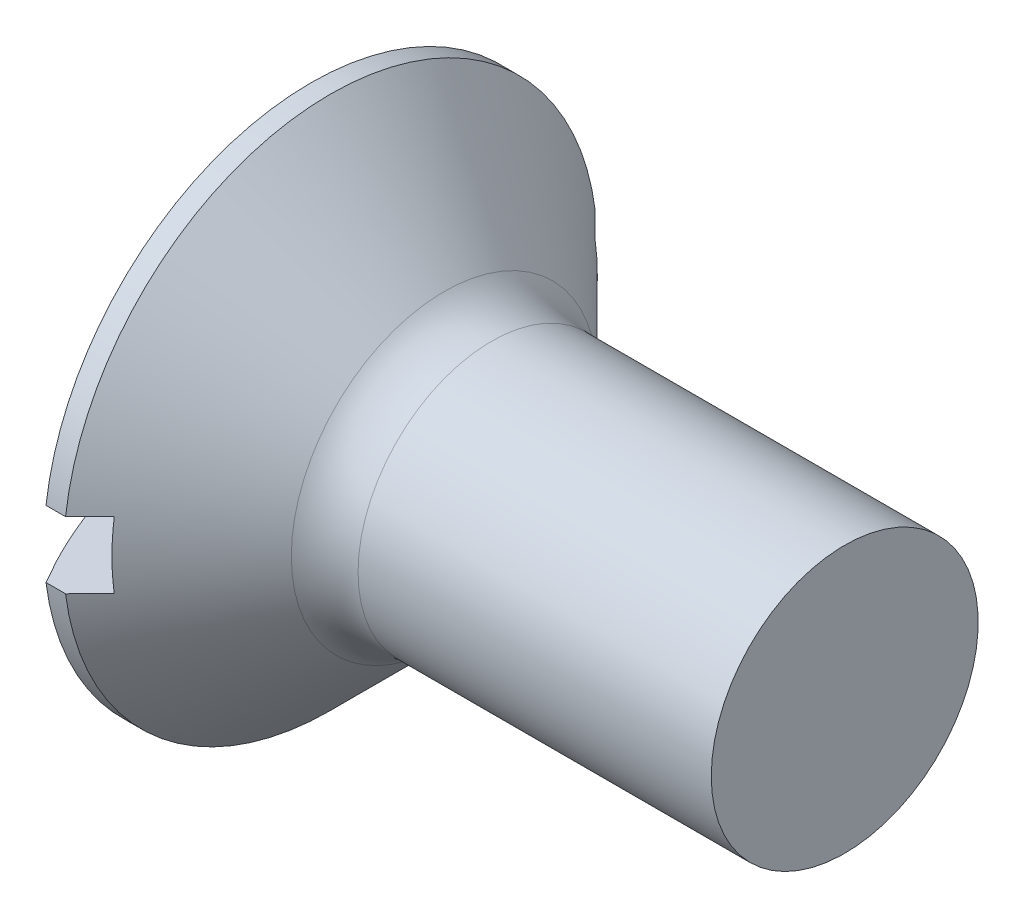
ISO-10303-21;
HEADER;
FILE_DESCRIPTION(('STEP AP214'),'2;1');
FILE_NAME('part.step','',(''),(''),'','','');
FILE_SCHEMA(('AUTOMOTIVE_DESIGN { 1 0 10303 214 1 1 1 1 }'));
ENDSEC;
DATA;
#1=APPLICATION_CONTEXT('core data for automotive mechanical design processes');
#2=APPLICATION_PROTOCOL_DEFINITION('international standard','automotive_design',2000,#1);
#3=PRODUCT_CONTEXT('',#1,'mechanical');
#4=PRODUCT('Part','Part','',(#3));
#5=PRODUCT_RELATED_PRODUCT_CATEGORY('part','',(#4));
#6=PRODUCT_DEFINITION_FORMATION('','',#4);
#7=PRODUCT_DEFINITION_CONTEXT('part definition',#1,'design');
#8=PRODUCT_DEFINITION('design','',#6,#7);
#9=PRODUCT_DEFINITION_SHAPE('','',#8);
#10=(LENGTH_UNIT() NAMED_UNIT(*) SI_UNIT(.MILLI.,.METRE.));
#11=(NAMED_UNIT(*) PLANE_ANGLE_UNIT() SI_UNIT($,.RADIAN.));
#12=(NAMED_UNIT(*) SI_UNIT($,.STERADIAN.) SOLID_ANGLE_UNIT());
#13=UNCERTAINTY_MEASURE_WITH_UNIT(LENGTH_MEASURE(1.E-05),#10,'distance_accuracy_value','');
#14=(GEOMETRIC_REPRESENTATION_CONTEXT(3) GLOBAL_UNCERTAINTY_ASSIGNED_CONTEXT((#13)) GLOBAL_UNIT_ASSIGNED_CONTEXT((#10,
#11,#12)) REPRESENTATION_CONTEXT('',''));
#15=CARTESIAN_POINT('',(0.,0.,0.));
#16=DIRECTION('',(0.,0.,1.));
#17=DIRECTION('',(1.,0.,0.));
#18=AXIS2_PLACEMENT_3D('',#15,#16,#17);
#19=CARTESIAN_POINT('',(-1.34990698556869,0.,0.));
#20=DIRECTION('',(-1.,0.,0.));
#21=DIRECTION('',(0.,0.,1.));
#22=AXIS2_PLACEMENT_3D('',#19,#20,#21);
#23=CYLINDRICAL_SURFACE('',#22,10.);
#24=CARTESIAN_POINT('',(3.49156400425037,0.,0.));
#25=DIRECTION('',(-1.,0.,0.));
#26=DIRECTION('',(0.,0.,1.));
#27=AXIS2_PLACEMENT_3D('',#24,#25,#26);
#28=CIRCLE('',#27,10.);
#29=CARTESIAN_POINT('',(3.49156400425037,-1.25,-9.92156741649221));
#30=VERTEX_POINT('',#29);
#31=CARTESIAN_POINT('',(3.49156400425037,-1.25,9.92156741649221));
#32=VERTEX_POINT('',#31);
#33=EDGE_CURVE('E107',#30,#32,#28,.T.);
#34=ORIENTED_EDGE('',*,*,#33,.T.);
#35=DIRECTION('',(-1.,0.,0.));
#36=VECTOR('',#35,1.);
#37=CARTESIAN_POINT('',(-1.34990698556869,-1.25,9.92156741649221));
#38=LINE('',#37,#36);
#39=CARTESIAN_POINT('',(2.7593309572168,-1.25,9.92156741649221));
#40=VERTEX_POINT('',#39);
#41=EDGE_CURVE('E112',#32,#40,#38,.T.);
#42=ORIENTED_EDGE('',*,*,#41,.T.);
#43=CARTESIAN_POINT('',(2.7593309572168,0.,0.));
#44=DIRECTION('',(-1.,0.,0.));
#45=DIRECTION('',(0.,0.,1.));
#46=AXIS2_PLACEMENT_3D('',#43,#44,#45);
#47=CIRCLE('',#46,10.);
#48=CARTESIAN_POINT('',(2.7593309572168,-1.25,-9.92156741649221));
#49=VERTEX_POINT('',#48);
#50=EDGE_CURVE('E157',#49,#40,#47,.T.);
#51=ORIENTED_EDGE('',*,*,#50,.F.);
#52=DIRECTION('',(-1.,0.,0.));
#53=VECTOR('',#52,1.);
#54=CARTESIAN_POINT('',(-1.34990698556869,-1.25,-9.92156741649221));
#55=LINE('',#54,#53);
#56=EDGE_CURVE('E52',#49,#30,#55,.F.);
#57=ORIENTED_EDGE('',*,*,#56,.T.);
#58=EDGE_LOOP('',(#34,#42,#51,#57));
#59=FACE_BOUND('',#58,.T.);
#60=ADVANCED_FACE('F37',(#59),#23,.T.);
#61=CARTESIAN_POINT('',(19.5,0.,0.));
#62=DIRECTION('',(-1.,0.,0.));
#63=DIRECTION('',(0.,1.,0.));
#64=AXIS2_PLACEMENT_3D('',#61,#62,#63);
#65=SPHERICAL_SURFACE('',#64,19.5);
#66=CARTESIAN_POINT('',(2.7593309572168,1.25,9.92156741649221));
#67=VERTEX_POINT('',#66);
#68=CARTESIAN_POINT('',(2.7593309572168,1.25,-9.92156741649221));
#69=VERTEX_POINT('',#68);
#70=EDGE_CURVE('E153',#67,#69,#47,.T.);
#71=ORIENTED_EDGE('',*,*,#70,.T.);
#72=CARTESIAN_POINT('',(19.5,1.25,0.));
#73=DIRECTION('',(0.,1.,0.));
#74=DIRECTION('',(0.,0.,1.));
#75=AXIS2_PLACEMENT_3D('',#72,#73,#74);
#76=CIRCLE('',#75,19.4598946554189);
#77=EDGE_CURVE('E170',#69,#67,#76,.T.);
#78=ORIENTED_EDGE('',*,*,#77,.T.);
#79=EDGE_LOOP('',(#71,#78));
#80=FACE_BOUND('',#79,.T.);
#81=ADVANCED_FACE('F135',(#80),#65,.T.);
#82=CARTESIAN_POINT('',(22.7593309572168,5.,0.));
#83=DIRECTION('',(-1.,0.,0.));
#84=DIRECTION('',(0.,0.,1.));
#85=AXIS2_PLACEMENT_3D('',#82,#83,#84);
#86=PLANE('',#85);
#87=CARTESIAN_POINT('',(22.7593309572168,0.,0.));
#88=DIRECTION('',(-1.,0.,0.));
#89=DIRECTION('',(0.,0.,1.));
#90=AXIS2_PLACEMENT_3D('',#87,#88,#89);
#91=CIRCLE('',#90,5.);
#92=CARTESIAN_POINT('',(22.7593309572168,0.,5.));
#93=VERTEX_POINT('',#92);
#94=EDGE_CURVE('E166',#93,#93,#91,.T.);
#95=ORIENTED_EDGE('',*,*,#94,.F.);
#96=EDGE_LOOP('',(#95));
#97=FACE_BOUND('',#96,.T.);
#98=ADVANCED_FACE('F39',(#97),#86,.F.);
#99=CARTESIAN_POINT('',(-1.34990698556869,0.,0.));
#100=DIRECTION('',(-1.,0.,0.));
#101=DIRECTION('',(0.,0.,1.));
#102=AXIS2_PLACEMENT_3D('',#99,#100,#101);
#103=CYLINDRICAL_SURFACE('',#102,5.);
#104=CARTESIAN_POINT('',(9.52709791018315,0.,0.));
#105=DIRECTION('',(-1.,0.,0.));
#106=DIRECTION('',(0.,0.,1.));
#107=AXIS2_PLACEMENT_3D('',#104,#105,#106);
#108=CIRCLE('',#107,5.);
#109=CARTESIAN_POINT('',(9.52709791018315,0.,5.));
#110=VERTEX_POINT('',#109);
#111=EDGE_CURVE('E163',#110,#110,#108,.T.);
#112=ORIENTED_EDGE('',*,*,#111,.F.);
#113=EDGE_LOOP('',(#112));
#114=FACE_BOUND('',#113,.T.);
#115=ORIENTED_EDGE('',*,*,#94,.T.);
#116=EDGE_LOOP('',(#115));
#117=FACE_BOUND('',#116,.T.);
#118=ADVANCED_FACE('F224',(#114,#117),#103,.T.);
#119=CARTESIAN_POINT('',(9.52709791018315,0.,0.));
#120=DIRECTION('',(-1.,0.,0.));
#121=DIRECTION('',(0.,0.,1.));
#122=AXIS2_PLACEMENT_3D('',#119,#120,#121);
#123=TOROIDAL_SURFACE('',#122,7.5,2.5);
#124=CARTESIAN_POINT('',(7.7593309572168,0.,0.));
#125=DIRECTION('',(-1.,0.,0.));
#126=DIRECTION('',(0.,0.,1.));
#127=AXIS2_PLACEMENT_3D('',#124,#125,#126);
#128=CIRCLE('',#127,5.73223304703362);
#129=CARTESIAN_POINT('',(7.7593309572168,0.,5.73223304703362));
#130=VERTEX_POINT('',#129);
#131=EDGE_CURVE('E155',#130,#130,#128,.T.);
#132=ORIENTED_EDGE('',*,*,#131,.F.);
#133=EDGE_LOOP('',(#132));
#134=FACE_BOUND('',#133,.T.);
#135=ORIENTED_EDGE('',*,*,#111,.T.);
#136=EDGE_LOOP('',(#135));
#137=FACE_BOUND('',#136,.T.);
#138=ADVANCED_FACE('F141',(#134,#137),#123,.F.);
#139=CARTESIAN_POINT('',(7.7593309572168,0.,0.));
#140=DIRECTION('',(-1.,0.,0.));
#141=DIRECTION('',(0.,0.,1.));
#142=AXIS2_PLACEMENT_3D('',#139,#140,#141);
#143=CONICAL_SURFACE('',#142,5.73223304703362,0.785398163397443);
#144=CARTESIAN_POINT('',(4.4,0.,0.));
#145=DIRECTION('',(1.,0.,0.));
#146=DIRECTION('',(0.,0.,-1.));
#147=AXIS2_PLACEMENT_3D('',#144,#145,#146);
#148=CIRCLE('',#147,9.09156400425038);
#149=CARTESIAN_POINT('',(4.4,-1.25,-9.00522270926051));
#150=VERTEX_POINT('',#149);
#151=CARTESIAN_POINT('',(4.4,1.25,-9.00522270926051));
#152=VERTEX_POINT('',#151);
#153=EDGE_CURVE('E11',#150,#152,#148,.T.);
#154=ORIENTED_EDGE('',*,*,#153,.T.);
#155=CARTESIAN_POINT('',(-8.5210084568838,1.25,21.9770527222527));
#156=CARTESIAN_POINT('',(-7.77459046825487,1.25,21.2294192782678));
#157=CARTESIAN_POINT('',(-7.02822538115535,1.25,20.4817329944474));
#158=CARTESIAN_POINT('',(-5.53565883518333,1.25,18.9861802505613));
#159=CARTESIAN_POINT('',(-4.78945737825683,1.25,18.2383137885535));
#160=CARTESIAN_POINT('',(-3.29710382126458,1.25,16.7421536346461));
#161=CARTESIAN_POINT('',(-2.55095178157776,1.25,15.993859882513));
#162=CARTESIAN_POINT('',(-1.05901809384018,1.25,14.4969196768421));
#163=CARTESIAN_POINT('',(-0.31323644179403,1.25,13.7482732272863));
#164=CARTESIAN_POINT('',(1.20309757390398,1.25,12.2249551252047));
#165=CARTESIAN_POINT('',(1.97363023118212,1.25,11.4502638467558));
#166=CARTESIAN_POINT('',(3.12860934886599,1.25,10.2873859679708));
#167=CARTESIAN_POINT('',(3.5134723746035,1.25,9.89961315246174));
#168=CARTESIAN_POINT('',(4.2827991933329,1.25,9.12367415732552));
#169=CARTESIAN_POINT('',(4.66726298767022,1.25,8.73550797903278));
#170=CARTESIAN_POINT('',(5.435543896864,1.25,7.95865990225889));
#171=CARTESIAN_POINT('',(5.81936110601367,1.25,7.56997809704624));
#172=CARTESIAN_POINT('',(6.58609943358192,1.25,6.79172057813529));
#173=CARTESIAN_POINT('',(6.96902054029294,1.25,6.4021448528882));
#174=CARTESIAN_POINT('',(7.54223572622382,1.25,5.81666163191678));
#175=CARTESIAN_POINT('',(7.7331073903337,1.25,5.6213197716481));
#176=CARTESIAN_POINT('',(8.11432239215397,1.25,5.23012137599832));
#177=CARTESIAN_POINT('',(8.30466573062535,1.25,5.03426484135936));
#178=CARTESIAN_POINT('',(8.68461171265303,1.25,4.64184228698441));
#179=CARTESIAN_POINT('',(8.87421437163768,1.25,4.44527628219255));
#180=CARTESIAN_POINT('',(9.25234979386876,1.25,4.05111842998579));
#181=CARTESIAN_POINT('',(9.44088256594153,1.25,3.85352659105963));
#182=CARTESIAN_POINT('',(9.67908675963146,1.25,3.6017737765406));
#183=CARTESIAN_POINT('',(9.72952895789286,1.25,3.54834203466148));
#184=CARTESIAN_POINT('',(9.83027400096096,1.25,3.44134714246871));
#185=CARTESIAN_POINT('',(9.88057684546789,1.25,3.38778399187285));
#186=CARTESIAN_POINT('',(10.0312499403482,1.25,3.22687097305208));
#187=CARTESIAN_POINT('',(10.1313833998896,1.25,3.1192989649367));
#188=CARTESIAN_POINT('',(10.3304737329636,1.25,2.90373796401289));
#189=CARTESIAN_POINT('',(10.4294334250587,1.25,2.79575157701191));
#190=CARTESIAN_POINT('',(10.6262029722584,1.25,2.57873972938056));
#191=CARTESIAN_POINT('',(10.7240128675377,1.25,2.46971430529729));
#192=CARTESIAN_POINT('',(10.885940598946,1.25,2.2864710814771));
#193=CARTESIAN_POINT('',(10.9505125404566,1.25,2.21265501202301));
#194=CARTESIAN_POINT('',(11.0786887980848,1.25,2.06418838602774));
#195=CARTESIAN_POINT('',(11.1422931361699,1.25,1.98953784849844));
#196=CARTESIAN_POINT('',(11.2686031831729,1.25,1.83868663789579));
#197=CARTESIAN_POINT('',(11.3313008604359,1.25,1.76247921793005));
#198=CARTESIAN_POINT('',(11.4548888005417,1.25,1.60861726458163));
#199=CARTESIAN_POINT('',(11.5157792411589,1.25,1.53096287476603));
#200=CARTESIAN_POINT('',(11.6357182809,1.25,1.37272319813638));
#201=CARTESIAN_POINT('',(11.6947350596234,1.25,1.29211362380905));
#202=CARTESIAN_POINT('',(11.8088938726199,1.25,1.12799254275528));
#203=CARTESIAN_POINT('',(11.864030664478,1.25,1.04447732930946));
#204=CARTESIAN_POINT('',(11.9676146867104,1.25,0.874335539973892));
#205=CARTESIAN_POINT('',(12.0161159679157,1.25,0.787742374080868));
#206=CARTESIAN_POINT('',(12.10298189127,1.25,0.609636933681097));
#207=CARTESIAN_POINT('',(12.1413773631534,1.25,0.518140669728003));
#208=CARTESIAN_POINT('',(12.1854118839439,1.25,0.381027069205683));
#209=CARTESIAN_POINT('',(12.1975130718092,1.25,0.3374973594457));
#210=CARTESIAN_POINT('',(12.2176285470174,1.25,0.249489947530802));
#211=CARTESIAN_POINT('',(12.2256434951664,1.25,0.205012399868222));
#212=CARTESIAN_POINT('',(12.2369955437869,1.25,0.11571293634987));
#213=CARTESIAN_POINT('',(12.2403593555015,1.25,0.0708944858358014));
#214=CARTESIAN_POINT('',(12.24222690368,1.25,-0.0188460458524877));
#215=CARTESIAN_POINT('',(12.2407306717652,1.25,-0.0637681263505541));
#216=CARTESIAN_POINT('',(12.2330156688538,1.25,-0.153018336382387));
#217=CARTESIAN_POINT('',(12.2268153624069,1.25,-0.197348100287958));
#218=CARTESIAN_POINT('',(12.2101667331401,1.25,-0.285206573365897));
#219=CARTESIAN_POINT('',(12.1997164973795,1.25,-0.328734912573649));
#220=CARTESIAN_POINT('',(12.1751123891266,1.25,-0.415055672831508));
#221=CARTESIAN_POINT('',(12.1609322581941,1.25,-0.457840487303176));
#222=CARTESIAN_POINT('',(12.1295715705004,1.25,-0.542271995496681));
#223=CARTESIAN_POINT('',(12.1123914342246,1.25,-0.583918847772237));
#224=CARTESIAN_POINT('',(12.0624558115133,1.25,-0.695591255880592));
#225=CARTESIAN_POINT('',(12.0273615115561,1.25,-0.764565939623531));
#226=CARTESIAN_POINT('',(11.9523730302416,1.25,-0.899877607189172));
#227=CARTESIAN_POINT('',(11.912473679034,1.25,-0.966211645965599));
#228=CARTESIAN_POINT('',(11.8292283624557,1.25,-1.09700000201585));
#229=CARTESIAN_POINT('',(11.7858704120328,1.25,-1.16144662212837));
#230=CARTESIAN_POINT('',(11.6968281985318,1.25,-1.28865663561613));
#231=CARTESIAN_POINT('',(11.6511449234887,1.25,-1.35142072687773));
#232=CARTESIAN_POINT('',(11.5576354281041,1.25,-1.47624621667462));
#233=CARTESIAN_POINT('',(11.5097931364247,1.25,-1.5382955164115));
#234=CARTESIAN_POINT('',(11.4128075991671,1.25,-1.66137348743609));
#235=CARTESIAN_POINT('',(11.3636642416826,1.25,-1.72240207018912));
#236=CARTESIAN_POINT('',(11.2645023424106,1.25,-1.84350440881135));
#237=CARTESIAN_POINT('',(11.2144861081493,1.25,-1.90358005905149));
#238=CARTESIAN_POINT('',(11.1136840371767,1.25,-2.02307662429863));
#239=CARTESIAN_POINT('',(11.0628982314503,1.25,-2.08249756550045));
#240=CARTESIAN_POINT('',(10.9117782380515,1.25,-2.25748212625086));
#241=CARTESIAN_POINT('',(10.8105820993205,1.25,-2.37230084673305));
#242=CARTESIAN_POINT('',(10.6066402649827,1.25,-2.6005560424567));
#243=CARTESIAN_POINT('',(10.5038944979266,1.25,-2.7139924535248));
#244=CARTESIAN_POINT('',(10.2972993882692,1.25,-2.93988316348039));
#245=CARTESIAN_POINT('',(10.1934498960664,1.25,-3.05233732536891));
#246=CARTESIAN_POINT('',(9.9849549542447,1.25,-3.27650595437661));
#247=CARTESIAN_POINT('',(9.88030949745755,1.25,-3.38822041481717));
#248=CARTESIAN_POINT('',(9.56524117114195,1.25,-3.72279494006523));
#249=CARTESIAN_POINT('',(9.35393193627091,1.25,-3.94481976145596));
#250=CARTESIAN_POINT('',(8.92991769941228,1.25,-4.38749349603825));
#251=CARTESIAN_POINT('',(8.71721281253933,1.25,-4.60814251985039));
#252=CARTESIAN_POINT('',(8.29302093560875,1.25,-5.04631864022675));
#253=CARTESIAN_POINT('',(8.08154328651223,1.25,-5.26385478422513));
#254=CARTESIAN_POINT('',(7.65795431295742,1.25,-5.69831766355356));
#255=CARTESIAN_POINT('',(7.44584297521573,1.25,-5.9152443859213));
#256=CARTESIAN_POINT('',(7.02127156530529,1.25,-6.34854756970485));
#257=CARTESIAN_POINT('',(6.80881171529761,1.25,-6.5649242488786));
#258=CARTESIAN_POINT('',(6.38355496925133,1.25,-6.99734318302461));
#259=CARTESIAN_POINT('',(6.17075807548307,1.25,-7.21338544023034));
#260=CARTESIAN_POINT('',(5.36307544986064,1.25,-8.03243463241916));
#261=CARTESIAN_POINT('',(4.76733732090775,1.25,-8.63460080855745));
#262=CARTESIAN_POINT('',(3.57485167996383,1.25,-9.83793575483227));
#263=CARTESIAN_POINT('',(2.97810416448477,1.25,-10.4391045215079));
#264=CARTESIAN_POINT('',(1.78387376778352,1.25,-11.640965920243));
#265=CARTESIAN_POINT('',(1.18639075691388,1.25,-12.2416584234769));
#266=CARTESIAN_POINT('',(-0.00896145628007322,1.25,-13.4426575261701));
#267=CARTESIAN_POINT('',(-0.606830658147653,1.25,-14.0429641260842));
#268=CARTESIAN_POINT('',(-1.81421131114186,1.25,-15.2547356622467));
#269=CARTESIAN_POINT('',(-2.42372781667038,1.25,-15.8661955621461));
#270=CARTESIAN_POINT('',(-3.64295342253514,1.25,-17.0889237868983));
#271=CARTESIAN_POINT('',(-4.25266252294791,1.25,-17.7001921116748));
#272=CARTESIAN_POINT('',(-5.4720845981906,1.25,-18.9224524751112));
#273=CARTESIAN_POINT('',(-6.081797541734,1.25,-19.5334445449865));
#274=CARTESIAN_POINT('',(-7.30133064839249,1.25,-20.7553211285018));
#275=CARTESIAN_POINT('',(-7.91115081145961,1.25,-21.3662056421897));
#276=CARTESIAN_POINT('',(-8.5210084568838,1.25,-21.9770527222527));
#277=B_SPLINE_CURVE_WITH_KNOTS('',3,(#155,#156,#157,#158,#159,#160,#161,#162,#163,#164,#165,
#166,#167,#168,#169,#170,#171,#172,#173,#174,#175,#176,#177,#178,#179,#180,#181,#182,#183,#184,
#185,#186,#187,#188,#189,#190,#191,#192,#193,#194,#195,#196,#197,#198,#199,#200,#201,#202,#203,
#204,#205,#206,#207,#208,#209,#210,#211,#212,#213,#214,#215,#216,#217,#218,#219,#220,#221,#222,
#223,#224,#225,#226,#227,#228,#229,#230,#231,#232,#233,#234,#235,#236,#237,#238,#239,#240,#241,
#242,#243,#244,#245,#246,#247,#248,#249,#250,#251,#252,#253,#254,#255,#256,#257,#258,#259,#260,
#261,#262,#263,#264,#265,#266,#267,#268,#269,#270,#271,#272,#273,#274,#275,#276),.UNSPECIFIED.,
.F.,.F.,(4,2,2,2,2,2,2,2,2,2,2,2,2,2,2,2,2,2,2,2,2,2,2,2,2,2,2,2,2,2,2,2,2,2,2,2,2,2,2,2,2,2,2,
2,2,2,2,2,2,2,2,2,2,2,2,2,2,2,2,2,4),(0.,3.16936276873897,6.33876138072179,9.50896280054216,
12.6791292464576,15.9570553141632,17.5960748900489,19.2350889242711,20.8738386273417,
22.5126096224223,23.3319464475525,24.1512820919031,24.9706005775197,25.7899122940773,
26.0103532151148,26.2307946099913,26.6716832976694,27.1110943565739,27.5504900162558,
27.8447034438926,28.1389101820101,28.4349436518962,28.7309479043731,29.0305888987939,
29.3306272718924,29.6280540046849,29.9245625773458,30.0599434458058,30.1953024142018,
30.3298807479769,30.4644582061383,30.5985101331155,30.7326224652652,30.8677054643967,
31.0027695452636,31.2346237575506,31.4667296932858,31.6996781436111,31.9325284267533,
32.1675610220161,32.4026138988397,32.6371187720238,32.871614228382,33.3307367614458,
33.7898805285668,34.2490873436219,34.7082982991224,35.6278071088516,36.5472410068803,
37.4574054592034,38.3675891261987,39.2773262256564,40.1870572229092,42.7282295575314,
45.2694106914265,47.8111335638748,50.3528534358951,52.9429387397973,55.5330250741153,
58.1225328592729,60.7120394888876),.UNSPECIFIED.);
#278=CARTESIAN_POINT('',(3.49156400425037,1.25,-9.92156741649221));
#279=VERTEX_POINT('',#278);
#280=EDGE_CURVE('E176',#152,#279,#277,.T.);
#281=ORIENTED_EDGE('',*,*,#280,.T.);
#282=CARTESIAN_POINT('',(3.49156400425037,1.25,9.92156741649221));
#283=VERTEX_POINT('',#282);
#284=EDGE_CURVE('E152',#283,#279,#28,.T.);
#285=ORIENTED_EDGE('',*,*,#284,.F.);
#286=CARTESIAN_POINT('',(4.4,1.25,9.00522270926051));
#287=VERTEX_POINT('',#286);
#288=EDGE_CURVE('E175',#283,#287,#277,.T.);
#289=ORIENTED_EDGE('',*,*,#288,.T.);
#290=CARTESIAN_POINT('',(4.4,-1.25,9.00522270926051));
#291=VERTEX_POINT('',#290);
#292=EDGE_CURVE('E41',#287,#291,#148,.T.);
#293=ORIENTED_EDGE('',*,*,#292,.T.);
#294=CARTESIAN_POINT('',(-8.5210084568838,-1.25,-21.9770527222527));
#295=CARTESIAN_POINT('',(-7.77459046825487,-1.25,-21.2294192782678));
#296=CARTESIAN_POINT('',(-7.02822538115535,-1.25,-20.4817329944474));
#297=CARTESIAN_POINT('',(-5.53565883518333,-1.25,-18.9861802505613));
#298=CARTESIAN_POINT('',(-4.78945737825683,-1.25,-18.2383137885535));
#299=CARTESIAN_POINT('',(-3.29710382126458,-1.25,-16.7421536346461));
#300=CARTESIAN_POINT('',(-2.55095178157776,-1.25,-15.993859882513));
#301=CARTESIAN_POINT('',(-1.05901809384018,-1.25,-14.4969196768421));
#302=CARTESIAN_POINT('',(-0.31323644179403,-1.25,-13.7482732272863));
#303=CARTESIAN_POINT('',(1.20309757390398,-1.25,-12.2249551252047));
#304=CARTESIAN_POINT('',(1.97363023118212,-1.25,-11.4502638467558));
#305=CARTESIAN_POINT('',(3.12860934886599,-1.25,-10.2873859679708));
#306=CARTESIAN_POINT('',(3.5134723746035,-1.25,-9.89961315246174));
#307=CARTESIAN_POINT('',(4.2827991933329,-1.25,-9.12367415732552));
#308=CARTESIAN_POINT('',(4.66726298767022,-1.25,-8.73550797903278));
#309=CARTESIAN_POINT('',(5.435543896864,-1.25,-7.95865990225889));
#310=CARTESIAN_POINT('',(5.81936110601367,-1.25,-7.56997809704624));
#311=CARTESIAN_POINT('',(6.58609943358192,-1.25,-6.79172057813529));
#312=CARTESIAN_POINT('',(6.96902054029294,-1.25,-6.4021448528882));
#313=CARTESIAN_POINT('',(7.54223572622382,-1.25,-5.81666163191678));
#314=CARTESIAN_POINT('',(7.7331073903337,-1.25,-5.6213197716481));
#315=CARTESIAN_POINT('',(8.11432239215397,-1.25,-5.23012137599832));
#316=CARTESIAN_POINT('',(8.30466573062535,-1.25,-5.03426484135936));
#317=CARTESIAN_POINT('',(8.68461171265303,-1.25,-4.64184228698441));
#318=CARTESIAN_POINT('',(8.87421437163768,-1.25,-4.44527628219255));
#319=CARTESIAN_POINT('',(9.25234979386876,-1.25,-4.05111842998579));
#320=CARTESIAN_POINT('',(9.44088256594153,-1.25,-3.85352659105963));
#321=CARTESIAN_POINT('',(9.67908675963146,-1.25,-3.6017737765406));
#322=CARTESIAN_POINT('',(9.72952895789286,-1.25,-3.54834203466148));
#323=CARTESIAN_POINT('',(9.83027400096096,-1.25,-3.44134714246871));
#324=CARTESIAN_POINT('',(9.88057684546789,-1.25,-3.38778399187285));
#325=CARTESIAN_POINT('',(10.0312499403482,-1.25,-3.22687097305208));
#326=CARTESIAN_POINT('',(10.1313833998896,-1.25,-3.1192989649367));
#327=CARTESIAN_POINT('',(10.3304737329636,-1.25,-2.90373796401289));
#328=CARTESIAN_POINT('',(10.4294334250587,-1.25,-2.79575157701191));
#329=CARTESIAN_POINT('',(10.6262029722584,-1.25,-2.57873972938056));
#330=CARTESIAN_POINT('',(10.7240128675377,-1.25,-2.46971430529729));
#331=CARTESIAN_POINT('',(10.885940598946,-1.25,-2.2864710814771));
#332=CARTESIAN_POINT('',(10.9505125404566,-1.25,-2.21265501202301));
#333=CARTESIAN_POINT('',(11.0786887980848,-1.25,-2.06418838602774));
#334=CARTESIAN_POINT('',(11.1422931361699,-1.25,-1.98953784849844));
#335=CARTESIAN_POINT('',(11.2686031831729,-1.25,-1.83868663789579));
#336=CARTESIAN_POINT('',(11.3313008604359,-1.25,-1.76247921793005));
#337=CARTESIAN_POINT('',(11.4548888005417,-1.25,-1.60861726458163));
#338=CARTESIAN_POINT('',(11.5157792411589,-1.25,-1.53096287476603));
#339=CARTESIAN_POINT('',(11.6357182809,-1.25,-1.37272319813638));
#340=CARTESIAN_POINT('',(11.6947350596234,-1.25,-1.29211362380905));
#341=CARTESIAN_POINT('',(11.8088938726199,-1.25,-1.12799254275528));
#342=CARTESIAN_POINT('',(11.864030664478,-1.25,-1.04447732930946));
#343=CARTESIAN_POINT('',(11.9676146867104,-1.25,-0.874335539973892));
#344=CARTESIAN_POINT('',(12.0161159679157,-1.25,-0.787742374080868));
#345=CARTESIAN_POINT('',(12.10298189127,-1.25,-0.609636933681097));
#346=CARTESIAN_POINT('',(12.1413773631534,-1.25,-0.518140669728003));
#347=CARTESIAN_POINT('',(12.1854118839439,-1.25,-0.381027069205683));
#348=CARTESIAN_POINT('',(12.1975130718092,-1.25,-0.3374973594457));
#349=CARTESIAN_POINT('',(12.2176285470174,-1.25,-0.249489947530802));
#350=CARTESIAN_POINT('',(12.2256434951664,-1.25,-0.205012399868222));
#351=CARTESIAN_POINT('',(12.2369955437869,-1.25,-0.11571293634987));
#352=CARTESIAN_POINT('',(12.2403593555015,-1.25,-0.0708944858358014));
#353=CARTESIAN_POINT('',(12.24222690368,-1.25,0.0188460458524877));
#354=CARTESIAN_POINT('',(12.2407306717652,-1.25,0.0637681263505541));
#355=CARTESIAN_POINT('',(12.2330156688538,-1.25,0.153018336382387));
#356=CARTESIAN_POINT('',(12.2268153624069,-1.25,0.197348100287958));
#357=CARTESIAN_POINT('',(12.2101667331401,-1.25,0.285206573365897));
#358=CARTESIAN_POINT('',(12.1997164973795,-1.25,0.328734912573649));
#359=CARTESIAN_POINT('',(12.1751123891266,-1.25,0.415055672831508));
#360=CARTESIAN_POINT('',(12.1609322581941,-1.25,0.457840487303176));
#361=CARTESIAN_POINT('',(12.1295715705004,-1.25,0.542271995496681));
#362=CARTESIAN_POINT('',(12.1123914342246,-1.25,0.583918847772237));
#363=CARTESIAN_POINT('',(12.0624558115133,-1.25,0.695591255880592));
#364=CARTESIAN_POINT('',(12.0273615115561,-1.25,0.764565939623531));
#365=CARTESIAN_POINT('',(11.9523730302416,-1.25,0.899877607189172));
#366=CARTESIAN_POINT('',(11.912473679034,-1.25,0.966211645965599));
#367=CARTESIAN_POINT('',(11.8292283624557,-1.25,1.09700000201585));
#368=CARTESIAN_POINT('',(11.7858704120328,-1.25,1.16144662212837));
#369=CARTESIAN_POINT('',(11.6968281985318,-1.25,1.28865663561613));
#370=CARTESIAN_POINT('',(11.6511449234887,-1.25,1.35142072687773));
#371=CARTESIAN_POINT('',(11.5576354281041,-1.25,1.47624621667462));
#372=CARTESIAN_POINT('',(11.5097931364247,-1.25,1.5382955164115));
#373=CARTESIAN_POINT('',(11.4128075991671,-1.25,1.66137348743609));
#374=CARTESIAN_POINT('',(11.3636642416826,-1.25,1.72240207018912));
#375=CARTESIAN_POINT('',(11.2645023424106,-1.25,1.84350440881135));
#376=CARTESIAN_POINT('',(11.2144861081493,-1.25,1.90358005905149));
#377=CARTESIAN_POINT('',(11.1136840371767,-1.25,2.02307662429863));
#378=CARTESIAN_POINT('',(11.0628982314503,-1.25,2.08249756550045));
#379=CARTESIAN_POINT('',(10.9117782380515,-1.25,2.25748212625086));
#380=CARTESIAN_POINT('',(10.8105820993205,-1.25,2.37230084673305));
#381=CARTESIAN_POINT('',(10.6066402649827,-1.25,2.6005560424567));
#382=CARTESIAN_POINT('',(10.5038944979266,-1.25,2.7139924535248));
#383=CARTESIAN_POINT('',(10.2972993882692,-1.25,2.93988316348039));
#384=CARTESIAN_POINT('',(10.1934498960664,-1.25,3.05233732536891));
#385=CARTESIAN_POINT('',(9.9849549542447,-1.25,3.27650595437661));
#386=CARTESIAN_POINT('',(9.88030949745755,-1.25,3.38822041481717));
#387=CARTESIAN_POINT('',(9.56524117114195,-1.25,3.72279494006523));
#388=CARTESIAN_POINT('',(9.35393193627091,-1.25,3.94481976145596));
#389=CARTESIAN_POINT('',(8.92991769941228,-1.25,4.38749349603825));
#390=CARTESIAN_POINT('',(8.71721281253933,-1.25,4.60814251985039));
#391=CARTESIAN_POINT('',(8.29302093560875,-1.25,5.04631864022675));
#392=CARTESIAN_POINT('',(8.08154328651223,-1.25,5.26385478422513));
#393=CARTESIAN_POINT('',(7.65795431295742,-1.25,5.69831766355356));
#394=CARTESIAN_POINT('',(7.44584297521573,-1.25,5.9152443859213));
#395=CARTESIAN_POINT('',(7.02127156530529,-1.25,6.34854756970485));
#396=CARTESIAN_POINT('',(6.80881171529761,-1.25,6.5649242488786));
#397=CARTESIAN_POINT('',(6.38355496925133,-1.25,6.99734318302461));
#398=CARTESIAN_POINT('',(6.17075807548307,-1.25,7.21338544023034));
#399=CARTESIAN_POINT('',(5.36307544986064,-1.25,8.03243463241916));
#400=CARTESIAN_POINT('',(4.76733732090775,-1.25,8.63460080855745));
#401=CARTESIAN_POINT('',(3.57485167996383,-1.25,9.83793575483227));
#402=CARTESIAN_POINT('',(2.97810416448477,-1.25,10.4391045215079));
#403=CARTESIAN_POINT('',(1.78387376778352,-1.25,11.640965920243));
#404=CARTESIAN_POINT('',(1.18639075691388,-1.25,12.2416584234769));
#405=CARTESIAN_POINT('',(-0.00896145628007322,-1.25,13.4426575261701));
#406=CARTESIAN_POINT('',(-0.606830658147653,-1.25,14.0429641260842));
#407=CARTESIAN_POINT('',(-1.81421131114186,-1.25,15.2547356622467));
#408=CARTESIAN_POINT('',(-2.42372781667038,-1.25,15.8661955621461));
#409=CARTESIAN_POINT('',(-3.64295342253514,-1.25,17.0889237868983));
#410=CARTESIAN_POINT('',(-4.25266252294791,-1.25,17.7001921116748));
#411=CARTESIAN_POINT('',(-5.4720845981906,-1.25,18.9224524751112));
#412=CARTESIAN_POINT('',(-6.081797541734,-1.25,19.5334445449865));
#413=CARTESIAN_POINT('',(-7.30133064839249,-1.25,20.7553211285018));
#414=CARTESIAN_POINT('',(-7.91115081145961,-1.25,21.3662056421897));
#415=CARTESIAN_POINT('',(-8.5210084568838,-1.25,21.9770527222527));
#416=B_SPLINE_CURVE_WITH_KNOTS('',3,(#294,#295,#296,#297,#298,#299,#300,#301,#302,#303,#304,
#305,#306,#307,#308,#309,#310,#311,#312,#313,#314,#315,#316,#317,#318,#319,#320,#321,#322,#323,
#324,#325,#326,#327,#328,#329,#330,#331,#332,#333,#334,#335,#336,#337,#338,#339,#340,#341,#342,
#343,#344,#345,#346,#347,#348,#349,#350,#351,#352,#353,#354,#355,#356,#357,#358,#359,#360,#361,
#362,#363,#364,#365,#366,#367,#368,#369,#370,#371,#372,#373,#374,#375,#376,#377,#378,#379,#380,
#381,#382,#383,#384,#385,#386,#387,#388,#389,#390,#391,#392,#393,#394,#395,#396,#397,#398,#399,
#400,#401,#402,#403,#404,#405,#406,#407,#408,#409,#410,#411,#412,#413,#414,#415),.UNSPECIFIED.,
.F.,.F.,(4,2,2,2,2,2,2,2,2,2,2,2,2,2,2,2,2,2,2,2,2,2,2,2,2,2,2,2,2,2,2,2,2,2,2,2,2,2,2,2,2,2,2,
2,2,2,2,2,2,2,2,2,2,2,2,2,2,2,2,2,4),(0.,3.16936276873897,6.33876138072179,9.50896280054216,
12.6791292464576,15.9570553141632,17.5960748900489,19.2350889242711,20.8738386273417,
22.5126096224223,23.3319464475525,24.1512820919031,24.9706005775197,25.7899122940773,
26.0103532151148,26.2307946099913,26.6716832976694,27.1110943565739,27.5504900162558,
27.8447034438926,28.1389101820101,28.4349436518962,28.7309479043731,29.0305888987939,
29.3306272718924,29.6280540046849,29.9245625773458,30.0599434458058,30.1953024142018,
30.3298807479769,30.4644582061383,30.5985101331155,30.7326224652652,30.8677054643967,
31.0027695452636,31.2346237575506,31.4667296932858,31.6996781436111,31.9325284267533,
32.1675610220161,32.4026138988397,32.6371187720238,32.871614228382,33.3307367614458,
33.7898805285668,34.2490873436219,34.7082982991224,35.6278071088516,36.5472410068803,
37.4574054592034,38.3675891261987,39.2773262256564,40.1870572229092,42.7282295575314,
45.2694106914265,47.8111335638748,50.3528534358951,52.9429387397973,55.5330250741153,
58.1225328592729,60.7120394888876),.UNSPECIFIED.);
#417=EDGE_CURVE('E101',#291,#32,#416,.T.);
#418=ORIENTED_EDGE('',*,*,#417,.T.);
#419=ORIENTED_EDGE('',*,*,#33,.F.);
#420=EDGE_CURVE('E99',#30,#150,#416,.T.);
#421=ORIENTED_EDGE('',*,*,#420,.T.);
#422=EDGE_LOOP('',(#154,#281,#285,#289,#293,#418,#419,#421));
#423=FACE_BOUND('',#422,.T.);
#424=ORIENTED_EDGE('',*,*,#131,.T.);
#425=EDGE_LOOP('',(#424));
#426=FACE_BOUND('',#425,.T.);
#427=ADVANCED_FACE('F104',(#423,#426),#143,.T.);
#428=ORIENTED_EDGE('',*,*,#284,.T.);
#429=DIRECTION('',(-1.,0.,0.));
#430=VECTOR('',#429,1.);
#431=CARTESIAN_POINT('',(-1.34990698556869,1.25,-9.92156741649221));
#432=LINE('',#431,#430);
#433=EDGE_CURVE('E60',#279,#69,#432,.T.);
#434=ORIENTED_EDGE('',*,*,#433,.T.);
#435=ORIENTED_EDGE('',*,*,#70,.F.);
#436=DIRECTION('',(-1.,0.,0.));
#437=VECTOR('',#436,1.);
#438=CARTESIAN_POINT('',(-1.34990698556869,1.25,9.92156741649221));
#439=LINE('',#438,#437);
#440=EDGE_CURVE('E108',#67,#283,#439,.F.);
#441=ORIENTED_EDGE('',*,*,#440,.T.);
#442=EDGE_LOOP('',(#428,#434,#435,#441));
#443=FACE_BOUND('',#442,.T.);
#444=ADVANCED_FACE('F133',(#443),#23,.T.);
#445=ORIENTED_EDGE('',*,*,#50,.T.);
#446=CARTESIAN_POINT('',(19.5,-1.25,0.));
#447=DIRECTION('',(0.,-1.,0.));
#448=DIRECTION('',(0.,0.,-1.));
#449=AXIS2_PLACEMENT_3D('',#446,#447,#448);
#450=CIRCLE('',#449,19.4598946554189);
#451=EDGE_CURVE('E169',#40,#49,#450,.T.);
#452=ORIENTED_EDGE('',*,*,#451,.T.);
#453=EDGE_LOOP('',(#445,#452));
#454=FACE_BOUND('',#453,.T.);
#455=ADVANCED_FACE('F131',(#454),#65,.T.);
#456=CARTESIAN_POINT('',(4.4,-1.25,-10.));
#457=DIRECTION('',(1.,0.,0.));
#458=DIRECTION('',(0.,0.,-1.));
#459=AXIS2_PLACEMENT_3D('',#456,#457,#458);
#460=PLANE('',#459);
#461=DIRECTION('',(0.,0.,1.));
#462=VECTOR('',#461,1.);
#463=CARTESIAN_POINT('',(4.4,1.25,-10.));
#464=LINE('',#463,#462);
#465=EDGE_CURVE('E95',#152,#287,#464,.T.);
#466=ORIENTED_EDGE('',*,*,#465,.F.);
#467=ORIENTED_EDGE('',*,*,#153,.F.);
#468=DIRECTION('',(0.,0.,1.));
#469=VECTOR('',#468,1.);
#470=CARTESIAN_POINT('',(4.4,-1.25,-10.));
#471=LINE('',#470,#469);
#472=EDGE_CURVE('E92',#150,#291,#471,.T.);
#473=ORIENTED_EDGE('',*,*,#472,.T.);
#474=ORIENTED_EDGE('',*,*,#292,.F.);
#475=EDGE_LOOP('',(#466,#467,#473,#474));
#476=FACE_BOUND('',#475,.T.);
#477=ADVANCED_FACE('F91',(#476),#460,.F.);
#478=CARTESIAN_POINT('',(0.,1.25,-10.));
#479=DIRECTION('',(0.,1.,0.));
#480=DIRECTION('',(0.,0.,1.));
#481=AXIS2_PLACEMENT_3D('',#478,#479,#480);
#482=PLANE('',#481);
#483=ORIENTED_EDGE('',*,*,#440,.F.);
#484=ORIENTED_EDGE('',*,*,#77,.F.);
#485=ORIENTED_EDGE('',*,*,#433,.F.);
#486=ORIENTED_EDGE('',*,*,#280,.F.);
#487=ORIENTED_EDGE('',*,*,#465,.T.);
#488=ORIENTED_EDGE('',*,*,#288,.F.);
#489=EDGE_LOOP('',(#483,#484,#485,#486,#487,#488));
#490=FACE_BOUND('',#489,.T.);
#491=ADVANCED_FACE('F129',(#490),#482,.F.);
#492=CARTESIAN_POINT('',(0.,-1.25,-10.));
#493=DIRECTION('',(0.,-1.,0.));
#494=DIRECTION('',(0.,0.,-1.));
#495=AXIS2_PLACEMENT_3D('',#492,#493,#494);
#496=PLANE('',#495);
#497=ORIENTED_EDGE('',*,*,#56,.F.);
#498=ORIENTED_EDGE('',*,*,#451,.F.);
#499=ORIENTED_EDGE('',*,*,#41,.F.);
#500=ORIENTED_EDGE('',*,*,#417,.F.);
#501=ORIENTED_EDGE('',*,*,#472,.F.);
#502=ORIENTED_EDGE('',*,*,#420,.F.);
#503=EDGE_LOOP('',(#497,#498,#499,#500,#501,#502));
#504=FACE_BOUND('',#503,.T.);
#505=ADVANCED_FACE('F98',(#504),#496,.F.);
#506=CLOSED_SHELL('',(#60,#81,#98,#118,#138,#427,#444,#455,#477,#491,#505));
#507=MANIFOLD_SOLID_BREP('B2',#506);
#508=ADVANCED_BREP_SHAPE_REPRESENTATION('',(#18,#507),#14);
#509=SHAPE_DEFINITION_REPRESENTATION(#9,#508);
ENDSEC;
END-ISO-10303-21;
